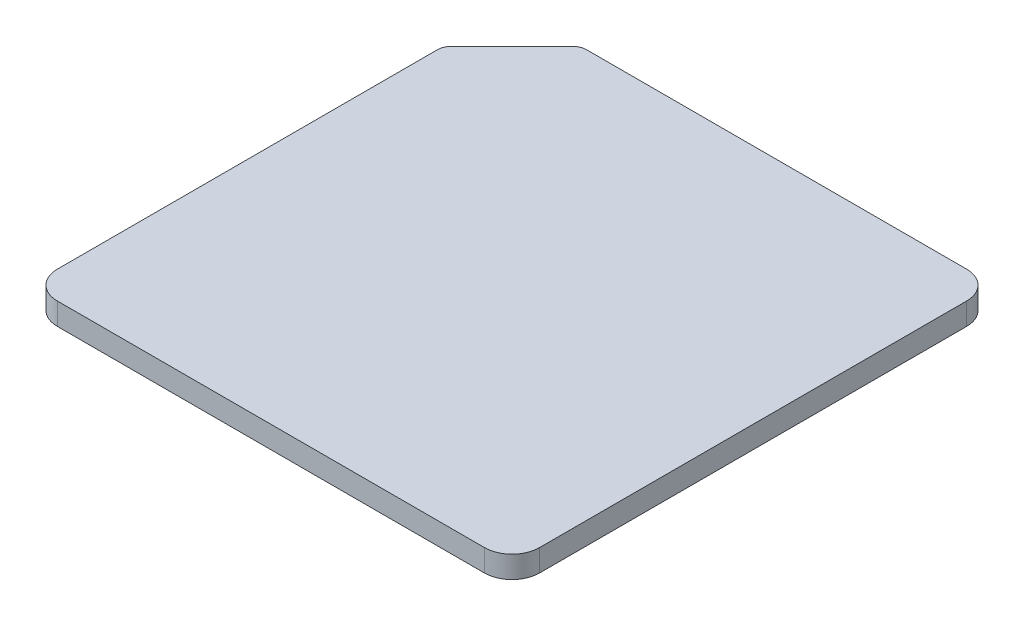
ISO-10303-21;
HEADER;
FILE_DESCRIPTION(('STEP AP214'),'2;1');
FILE_NAME('part.step','',(''),(''),'','','');
FILE_SCHEMA(('AUTOMOTIVE_DESIGN { 1 0 10303 214 1 1 1 1 }'));
ENDSEC;
DATA;
#1=APPLICATION_CONTEXT('core data for automotive mechanical design processes');
#2=APPLICATION_PROTOCOL_DEFINITION('international standard','automotive_design',2000,#1);
#3=PRODUCT_CONTEXT('',#1,'mechanical');
#4=PRODUCT('Part','Part','',(#3));
#5=PRODUCT_RELATED_PRODUCT_CATEGORY('part','',(#4));
#6=PRODUCT_DEFINITION_FORMATION('','',#4);
#7=PRODUCT_DEFINITION_CONTEXT('part definition',#1,'design');
#8=PRODUCT_DEFINITION('design','',#6,#7);
#9=PRODUCT_DEFINITION_SHAPE('','',#8);
#10=(LENGTH_UNIT() NAMED_UNIT(*) SI_UNIT(.MILLI.,.METRE.));
#11=(NAMED_UNIT(*) PLANE_ANGLE_UNIT() SI_UNIT($,.RADIAN.));
#12=(NAMED_UNIT(*) SI_UNIT($,.STERADIAN.) SOLID_ANGLE_UNIT());
#13=UNCERTAINTY_MEASURE_WITH_UNIT(LENGTH_MEASURE(1.E-05),#10,'distance_accuracy_value','');
#14=(GEOMETRIC_REPRESENTATION_CONTEXT(3) GLOBAL_UNCERTAINTY_ASSIGNED_CONTEXT((#13)) GLOBAL_UNIT_ASSIGNED_CONTEXT((#10,
#11,#12)) REPRESENTATION_CONTEXT('',''));
#15=CARTESIAN_POINT('',(0.,0.,0.));
#16=DIRECTION('',(0.,0.,1.));
#17=DIRECTION('',(1.,0.,0.));
#18=AXIS2_PLACEMENT_3D('',#15,#16,#17);
#19=CARTESIAN_POINT('',(17.5,1.6,-17.5));
#20=DIRECTION('',(-1.,0.,0.));
#21=DIRECTION('',(0.,0.,1.));
#22=AXIS2_PLACEMENT_3D('',#19,#20,#21);
#23=PLANE('',#22);
#24=DIRECTION('',(0.,0.,-1.));
#25=VECTOR('',#24,1.);
#26=CARTESIAN_POINT('',(17.5,0.,-17.5));
#27=LINE('',#26,#25);
#28=CARTESIAN_POINT('',(17.5,0.,15.5));
#29=VERTEX_POINT('',#28);
#30=CARTESIAN_POINT('',(17.5,0.,-15.5));
#31=VERTEX_POINT('',#30);
#32=EDGE_CURVE('E227',#29,#31,#27,.T.);
#33=ORIENTED_EDGE('',*,*,#32,.T.);
#34=DIRECTION('',(0.,-1.,0.));
#35=VECTOR('',#34,1.);
#36=CARTESIAN_POINT('',(17.5,1.6,-15.5));
#37=LINE('',#36,#35);
#38=CARTESIAN_POINT('',(17.5,1.6,-15.5));
#39=VERTEX_POINT('',#38);
#40=EDGE_CURVE('E184',#31,#39,#37,.F.);
#41=ORIENTED_EDGE('',*,*,#40,.T.);
#42=DIRECTION('',(0.,0.,-1.));
#43=VECTOR('',#42,1.);
#44=CARTESIAN_POINT('',(17.5,1.6,-17.5));
#45=LINE('',#44,#43);
#46=CARTESIAN_POINT('',(17.5,1.6,15.5));
#47=VERTEX_POINT('',#46);
#48=EDGE_CURVE('E209',#47,#39,#45,.T.);
#49=ORIENTED_EDGE('',*,*,#48,.F.);
#50=DIRECTION('',(0.,-1.,0.));
#51=VECTOR('',#50,1.);
#52=CARTESIAN_POINT('',(17.5,1.6,15.5));
#53=LINE('',#52,#51);
#54=EDGE_CURVE('E180',#47,#29,#53,.T.);
#55=ORIENTED_EDGE('',*,*,#54,.T.);
#56=EDGE_LOOP('',(#33,#41,#49,#55));
#57=FACE_BOUND('',#56,.T.);
#58=ADVANCED_FACE('F39',(#57),#23,.F.);
#59=CARTESIAN_POINT('',(-17.5,1.6,-17.5));
#60=DIRECTION('',(0.,0.,1.));
#61=DIRECTION('',(1.,0.,0.));
#62=AXIS2_PLACEMENT_3D('',#59,#60,#61);
#63=PLANE('',#62);
#64=DIRECTION('',(-1.,0.,0.));
#65=VECTOR('',#64,1.);
#66=CARTESIAN_POINT('',(-17.5,1.6,-17.5));
#67=LINE('',#66,#65);
#68=CARTESIAN_POINT('',(15.5,1.6,-17.5));
#69=VERTEX_POINT('',#68);
#70=CARTESIAN_POINT('',(-12.0857864376269,1.6,-17.5));
#71=VERTEX_POINT('',#70);
#72=EDGE_CURVE('E139',#69,#71,#67,.T.);
#73=ORIENTED_EDGE('',*,*,#72,.F.);
#74=DIRECTION('',(0.,-1.,0.));
#75=VECTOR('',#74,1.);
#76=CARTESIAN_POINT('',(15.5,1.6,-17.5));
#77=LINE('',#76,#75);
#78=CARTESIAN_POINT('',(15.5,0.,-17.5));
#79=VERTEX_POINT('',#78);
#80=EDGE_CURVE('E167',#69,#79,#77,.T.);
#81=ORIENTED_EDGE('',*,*,#80,.T.);
#82=DIRECTION('',(-1.,0.,0.));
#83=VECTOR('',#82,1.);
#84=CARTESIAN_POINT('',(-17.5,0.,-17.5));
#85=LINE('',#84,#83);
#86=CARTESIAN_POINT('',(-12.0857864376269,0.,-17.5));
#87=VERTEX_POINT('',#86);
#88=EDGE_CURVE('E215',#79,#87,#85,.T.);
#89=ORIENTED_EDGE('',*,*,#88,.T.);
#90=DIRECTION('',(0.,-1.,0.));
#91=VECTOR('',#90,1.);
#92=CARTESIAN_POINT('',(-12.0857864376269,1.6,-17.5));
#93=LINE('',#92,#91);
#94=EDGE_CURVE('E127',#87,#71,#93,.F.);
#95=ORIENTED_EDGE('',*,*,#94,.T.);
#96=EDGE_LOOP('',(#73,#81,#89,#95));
#97=FACE_BOUND('',#96,.T.);
#98=ADVANCED_FACE('F233',(#97),#63,.F.);
#99=CARTESIAN_POINT('',(-17.5,1.6,-17.5));
#100=DIRECTION('',(1.,0.,0.));
#101=DIRECTION('',(0.,0.,-1.));
#102=AXIS2_PLACEMENT_3D('',#99,#100,#101);
#103=PLANE('',#102);
#104=DIRECTION('',(0.,0.,1.));
#105=VECTOR('',#104,1.);
#106=CARTESIAN_POINT('',(-17.5,0.,-17.5));
#107=LINE('',#106,#105);
#108=CARTESIAN_POINT('',(-17.5,0.,-12.0857864376269));
#109=VERTEX_POINT('',#108);
#110=CARTESIAN_POINT('',(-17.5,0.,15.5));
#111=VERTEX_POINT('',#110);
#112=EDGE_CURVE('E210',#109,#111,#107,.T.);
#113=ORIENTED_EDGE('',*,*,#112,.T.);
#114=DIRECTION('',(0.,-1.,0.));
#115=VECTOR('',#114,1.);
#116=CARTESIAN_POINT('',(-17.5,1.6,15.5));
#117=LINE('',#116,#115);
#118=CARTESIAN_POINT('',(-17.5,1.6,15.5));
#119=VERTEX_POINT('',#118);
#120=EDGE_CURVE('E11',#111,#119,#117,.F.);
#121=ORIENTED_EDGE('',*,*,#120,.T.);
#122=DIRECTION('',(0.,0.,1.));
#123=VECTOR('',#122,1.);
#124=CARTESIAN_POINT('',(-17.5,1.6,-17.5));
#125=LINE('',#124,#123);
#126=CARTESIAN_POINT('',(-17.5,1.6,-12.0857864376269));
#127=VERTEX_POINT('',#126);
#128=EDGE_CURVE('E120',#127,#119,#125,.T.);
#129=ORIENTED_EDGE('',*,*,#128,.F.);
#130=DIRECTION('',(0.,1.,0.));
#131=VECTOR('',#130,1.);
#132=CARTESIAN_POINT('',(-17.5,0.,-12.0857864376269));
#133=LINE('',#132,#131);
#134=EDGE_CURVE('E134',#127,#109,#133,.F.);
#135=ORIENTED_EDGE('',*,*,#134,.T.);
#136=EDGE_LOOP('',(#113,#121,#129,#135));
#137=FACE_BOUND('',#136,.T.);
#138=ADVANCED_FACE('F133',(#137),#103,.F.);
#139=CARTESIAN_POINT('',(-17.5,1.6,17.5));
#140=DIRECTION('',(0.,0.,-1.));
#141=DIRECTION('',(-1.,0.,0.));
#142=AXIS2_PLACEMENT_3D('',#139,#140,#141);
#143=PLANE('',#142);
#144=DIRECTION('',(1.,0.,0.));
#145=VECTOR('',#144,1.);
#146=CARTESIAN_POINT('',(-17.5,0.,17.5));
#147=LINE('',#146,#145);
#148=CARTESIAN_POINT('',(-15.5,0.,17.5));
#149=VERTEX_POINT('',#148);
#150=CARTESIAN_POINT('',(15.5,0.,17.5));
#151=VERTEX_POINT('',#150);
#152=EDGE_CURVE('E202',#149,#151,#147,.T.);
#153=ORIENTED_EDGE('',*,*,#152,.T.);
#154=DIRECTION('',(0.,-1.,0.));
#155=VECTOR('',#154,1.);
#156=CARTESIAN_POINT('',(15.5,1.6,17.5));
#157=LINE('',#156,#155);
#158=CARTESIAN_POINT('',(15.5,1.6,17.5));
#159=VERTEX_POINT('',#158);
#160=EDGE_CURVE('E48',#151,#159,#157,.F.);
#161=ORIENTED_EDGE('',*,*,#160,.T.);
#162=DIRECTION('',(1.,0.,0.));
#163=VECTOR('',#162,1.);
#164=CARTESIAN_POINT('',(-17.5,1.6,17.5));
#165=LINE('',#164,#163);
#166=CARTESIAN_POINT('',(-15.5,1.6,17.5));
#167=VERTEX_POINT('',#166);
#168=EDGE_CURVE('E138',#167,#159,#165,.T.);
#169=ORIENTED_EDGE('',*,*,#168,.F.);
#170=DIRECTION('',(0.,-1.,0.));
#171=VECTOR('',#170,1.);
#172=CARTESIAN_POINT('',(-15.5,1.6,17.5));
#173=LINE('',#172,#171);
#174=EDGE_CURVE('E195',#167,#149,#173,.T.);
#175=ORIENTED_EDGE('',*,*,#174,.T.);
#176=EDGE_LOOP('',(#153,#161,#169,#175));
#177=FACE_BOUND('',#176,.T.);
#178=ADVANCED_FACE('F201',(#177),#143,.F.);
#179=CARTESIAN_POINT('',(0.,1.6,0.));
#180=DIRECTION('',(0.,1.,0.));
#181=DIRECTION('',(0.,0.,1.));
#182=AXIS2_PLACEMENT_3D('',#179,#180,#181);
#183=PLANE('',#182);
#184=ORIENTED_EDGE('',*,*,#48,.T.);
#185=CARTESIAN_POINT('',(15.5,1.6,-15.5));
#186=DIRECTION('',(0.,1.,0.));
#187=DIRECTION('',(0.,0.,1.));
#188=AXIS2_PLACEMENT_3D('',#185,#186,#187);
#189=CIRCLE('',#188,2.);
#190=EDGE_CURVE('E192',#39,#69,#189,.T.);
#191=ORIENTED_EDGE('',*,*,#190,.T.);
#192=ORIENTED_EDGE('',*,*,#72,.T.);
#193=CARTESIAN_POINT('',(-12.0857864376269,1.6,-16.5));
#194=DIRECTION('',(0.,1.,0.));
#195=DIRECTION('',(0.,0.,1.));
#196=AXIS2_PLACEMENT_3D('',#193,#194,#195);
#197=CIRCLE('',#196,1.);
#198=CARTESIAN_POINT('',(-12.7928932188135,1.6,-17.2071067811865));
#199=VERTEX_POINT('',#198);
#200=EDGE_CURVE('E128',#71,#199,#197,.T.);
#201=ORIENTED_EDGE('',*,*,#200,.T.);
#202=DIRECTION('',(0.707106781186549,0.,-0.707106781186547));
#203=VECTOR('',#202,1.);
#204=CARTESIAN_POINT('',(-15.,1.6,-15.));
#205=LINE('',#204,#203);
#206=CARTESIAN_POINT('',(-17.2071067811865,1.6,-12.7928932188135));
#207=VERTEX_POINT('',#206);
#208=EDGE_CURVE('E122',#199,#207,#205,.F.);
#209=ORIENTED_EDGE('',*,*,#208,.T.);
#210=CARTESIAN_POINT('',(-16.5,1.6,-12.0857864376269));
#211=DIRECTION('',(0.,1.,0.));
#212=DIRECTION('',(0.,0.,1.));
#213=AXIS2_PLACEMENT_3D('',#210,#211,#212);
#214=CIRCLE('',#213,1.);
#215=EDGE_CURVE('E116',#207,#127,#214,.T.);
#216=ORIENTED_EDGE('',*,*,#215,.T.);
#217=ORIENTED_EDGE('',*,*,#128,.T.);
#218=CARTESIAN_POINT('',(-15.5,1.6,15.5));
#219=DIRECTION('',(0.,1.,0.));
#220=DIRECTION('',(0.,0.,1.));
#221=AXIS2_PLACEMENT_3D('',#218,#219,#220);
#222=CIRCLE('',#221,2.);
#223=EDGE_CURVE('E61',#119,#167,#222,.T.);
#224=ORIENTED_EDGE('',*,*,#223,.T.);
#225=ORIENTED_EDGE('',*,*,#168,.T.);
#226=CARTESIAN_POINT('',(15.5,1.6,15.5));
#227=DIRECTION('',(0.,1.,0.));
#228=DIRECTION('',(0.,0.,1.));
#229=AXIS2_PLACEMENT_3D('',#226,#227,#228);
#230=CIRCLE('',#229,2.);
#231=EDGE_CURVE('E189',#159,#47,#230,.T.);
#232=ORIENTED_EDGE('',*,*,#231,.T.);
#233=EDGE_LOOP('',(#184,#191,#192,#201,#209,#216,#217,#224,#225,#232));
#234=FACE_BOUND('',#233,.T.);
#235=ADVANCED_FACE('F119',(#234),#183,.T.);
#236=CARTESIAN_POINT('',(0.,0.,0.));
#237=DIRECTION('',(0.,1.,0.));
#238=DIRECTION('',(0.,0.,1.));
#239=AXIS2_PLACEMENT_3D('',#236,#237,#238);
#240=PLANE('',#239);
#241=ORIENTED_EDGE('',*,*,#88,.F.);
#242=CARTESIAN_POINT('',(15.5,0.,-15.5));
#243=DIRECTION('',(0.,1.,0.));
#244=DIRECTION('',(0.,0.,1.));
#245=AXIS2_PLACEMENT_3D('',#242,#243,#244);
#246=CIRCLE('',#245,2.);
#247=EDGE_CURVE('E177',#79,#31,#246,.F.);
#248=ORIENTED_EDGE('',*,*,#247,.T.);
#249=ORIENTED_EDGE('',*,*,#32,.F.);
#250=CARTESIAN_POINT('',(15.5,0.,15.5));
#251=DIRECTION('',(0.,1.,0.));
#252=DIRECTION('',(0.,0.,1.));
#253=AXIS2_PLACEMENT_3D('',#250,#251,#252);
#254=CIRCLE('',#253,2.);
#255=EDGE_CURVE('E174',#29,#151,#254,.F.);
#256=ORIENTED_EDGE('',*,*,#255,.T.);
#257=ORIENTED_EDGE('',*,*,#152,.F.);
#258=CARTESIAN_POINT('',(-15.5,0.,15.5));
#259=DIRECTION('',(0.,1.,0.));
#260=DIRECTION('',(0.,0.,1.));
#261=AXIS2_PLACEMENT_3D('',#258,#259,#260);
#262=CIRCLE('',#261,2.);
#263=EDGE_CURVE('E171',#149,#111,#262,.F.);
#264=ORIENTED_EDGE('',*,*,#263,.T.);
#265=ORIENTED_EDGE('',*,*,#112,.F.);
#266=CARTESIAN_POINT('',(-16.5,0.,-12.0857864376269));
#267=DIRECTION('',(0.,1.,0.));
#268=DIRECTION('',(0.,0.,1.));
#269=AXIS2_PLACEMENT_3D('',#266,#267,#268);
#270=CIRCLE('',#269,1.);
#271=CARTESIAN_POINT('',(-17.2071067811865,0.,-12.7928932188135));
#272=VERTEX_POINT('',#271);
#273=EDGE_CURVE('E142',#109,#272,#270,.F.);
#274=ORIENTED_EDGE('',*,*,#273,.T.);
#275=DIRECTION('',(-0.707106781186549,0.,0.707106781186547));
#276=VECTOR('',#275,1.);
#277=CARTESIAN_POINT('',(-17.5,0.,-12.5));
#278=LINE('',#277,#276);
#279=CARTESIAN_POINT('',(-12.7928932188135,0.,-17.2071067811865));
#280=VERTEX_POINT('',#279);
#281=EDGE_CURVE('E150',#272,#280,#278,.F.);
#282=ORIENTED_EDGE('',*,*,#281,.T.);
#283=CARTESIAN_POINT('',(-12.0857864376269,0.,-16.5));
#284=DIRECTION('',(0.,1.,0.));
#285=DIRECTION('',(0.,0.,1.));
#286=AXIS2_PLACEMENT_3D('',#283,#284,#285);
#287=CIRCLE('',#286,1.);
#288=EDGE_CURVE('E144',#280,#87,#287,.F.);
#289=ORIENTED_EDGE('',*,*,#288,.T.);
#290=EDGE_LOOP('',(#241,#248,#249,#256,#257,#264,#265,#274,#282,#289));
#291=FACE_BOUND('',#290,.T.);
#292=ADVANCED_FACE('F206',(#291),#240,.F.);
#293=CARTESIAN_POINT('',(-17.5,1.6,-12.5));
#294=DIRECTION('',(0.707106781186546,0.,0.707106781186548));
#295=DIRECTION('',(0.,-1.,0.));
#296=AXIS2_PLACEMENT_3D('',#293,#294,#295);
#297=PLANE('',#296);
#298=ORIENTED_EDGE('',*,*,#281,.F.);
#299=DIRECTION('',(0.,-1.,0.));
#300=VECTOR('',#299,1.);
#301=CARTESIAN_POINT('',(-17.2071067811865,1.6,-12.7928932188135));
#302=LINE('',#301,#300);
#303=EDGE_CURVE('E159',#272,#207,#302,.F.);
#304=ORIENTED_EDGE('',*,*,#303,.T.);
#305=ORIENTED_EDGE('',*,*,#208,.F.);
#306=DIRECTION('',(0.,1.,0.));
#307=VECTOR('',#306,1.);
#308=CARTESIAN_POINT('',(-12.7928932188135,0.,-17.2071067811865));
#309=LINE('',#308,#307);
#310=EDGE_CURVE('E156',#199,#280,#309,.F.);
#311=ORIENTED_EDGE('',*,*,#310,.T.);
#312=EDGE_LOOP('',(#298,#304,#305,#311));
#313=FACE_BOUND('',#312,.T.);
#314=ADVANCED_FACE('F241',(#313),#297,.F.);
#315=CARTESIAN_POINT('',(-16.5,1.6,-12.0857864376269));
#316=DIRECTION('',(0.,-1.,0.));
#317=DIRECTION('',(0.,0.,-1.));
#318=AXIS2_PLACEMENT_3D('',#315,#316,#317);
#319=CYLINDRICAL_SURFACE('',#318,1.);
#320=ORIENTED_EDGE('',*,*,#215,.F.);
#321=ORIENTED_EDGE('',*,*,#303,.F.);
#322=ORIENTED_EDGE('',*,*,#273,.F.);
#323=ORIENTED_EDGE('',*,*,#134,.F.);
#324=EDGE_LOOP('',(#320,#321,#322,#323));
#325=FACE_BOUND('',#324,.T.);
#326=ADVANCED_FACE('F141',(#325),#319,.T.);
#327=CARTESIAN_POINT('',(-12.0857864376269,1.6,-16.5));
#328=DIRECTION('',(0.,1.,0.));
#329=DIRECTION('',(0.,0.,1.));
#330=AXIS2_PLACEMENT_3D('',#327,#328,#329);
#331=CYLINDRICAL_SURFACE('',#330,1.);
#332=ORIENTED_EDGE('',*,*,#288,.F.);
#333=ORIENTED_EDGE('',*,*,#310,.F.);
#334=ORIENTED_EDGE('',*,*,#200,.F.);
#335=ORIENTED_EDGE('',*,*,#94,.F.);
#336=EDGE_LOOP('',(#332,#333,#334,#335));
#337=FACE_BOUND('',#336,.T.);
#338=ADVANCED_FACE('F239',(#337),#331,.T.);
#339=CARTESIAN_POINT('',(15.5,1.6,-15.5));
#340=DIRECTION('',(0.,-1.,0.));
#341=DIRECTION('',(0.,0.,-1.));
#342=AXIS2_PLACEMENT_3D('',#339,#340,#341);
#343=CYLINDRICAL_SURFACE('',#342,2.);
#344=ORIENTED_EDGE('',*,*,#190,.F.);
#345=ORIENTED_EDGE('',*,*,#40,.F.);
#346=ORIENTED_EDGE('',*,*,#247,.F.);
#347=ORIENTED_EDGE('',*,*,#80,.F.);
#348=EDGE_LOOP('',(#344,#345,#346,#347));
#349=FACE_BOUND('',#348,.T.);
#350=ADVANCED_FACE('F277',(#349),#343,.T.);
#351=CARTESIAN_POINT('',(15.5,1.6,15.5));
#352=DIRECTION('',(0.,-1.,0.));
#353=DIRECTION('',(0.,0.,-1.));
#354=AXIS2_PLACEMENT_3D('',#351,#352,#353);
#355=CYLINDRICAL_SURFACE('',#354,2.);
#356=ORIENTED_EDGE('',*,*,#231,.F.);
#357=ORIENTED_EDGE('',*,*,#160,.F.);
#358=ORIENTED_EDGE('',*,*,#255,.F.);
#359=ORIENTED_EDGE('',*,*,#54,.F.);
#360=EDGE_LOOP('',(#356,#357,#358,#359));
#361=FACE_BOUND('',#360,.T.);
#362=ADVANCED_FACE('F282',(#361),#355,.T.);
#363=CARTESIAN_POINT('',(-15.5,1.6,15.5));
#364=DIRECTION('',(0.,-1.,0.));
#365=DIRECTION('',(0.,0.,-1.));
#366=AXIS2_PLACEMENT_3D('',#363,#364,#365);
#367=CYLINDRICAL_SURFACE('',#366,2.);
#368=ORIENTED_EDGE('',*,*,#223,.F.);
#369=ORIENTED_EDGE('',*,*,#120,.F.);
#370=ORIENTED_EDGE('',*,*,#263,.F.);
#371=ORIENTED_EDGE('',*,*,#174,.F.);
#372=EDGE_LOOP('',(#368,#369,#370,#371));
#373=FACE_BOUND('',#372,.T.);
#374=ADVANCED_FACE('F41',(#373),#367,.T.);
#375=CLOSED_SHELL('',(#58,#98,#138,#178,#235,#292,#314,#326,#338,#350,#362,#374));
#376=MANIFOLD_SOLID_BREP('B2',#375);
#377=ADVANCED_BREP_SHAPE_REPRESENTATION('',(#18,#376),#14);
#378=SHAPE_DEFINITION_REPRESENTATION(#9,#377);
ENDSEC;
END-ISO-10303-21;
